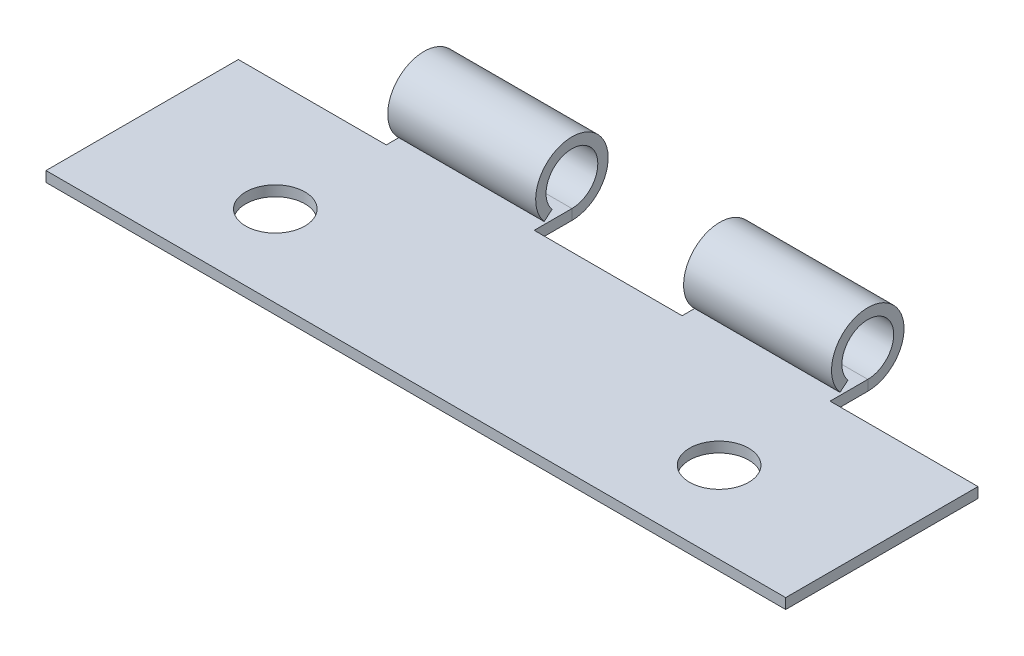
ISO-10303-21;
HEADER;
FILE_DESCRIPTION(('STEP AP214'),'2;1');
FILE_NAME('part.step','',(''),(''),'','','');
FILE_SCHEMA(('AUTOMOTIVE_DESIGN { 1 0 10303 214 1 1 1 1 }'));
ENDSEC;
DATA;
#1=APPLICATION_CONTEXT('core data for automotive mechanical design processes');
#2=APPLICATION_PROTOCOL_DEFINITION('international standard','automotive_design',2000,#1);
#3=PRODUCT_CONTEXT('',#1,'mechanical');
#4=PRODUCT('Part','Part','',(#3));
#5=PRODUCT_RELATED_PRODUCT_CATEGORY('part','',(#4));
#6=PRODUCT_DEFINITION_FORMATION('','',#4);
#7=PRODUCT_DEFINITION_CONTEXT('part definition',#1,'design');
#8=PRODUCT_DEFINITION('design','',#6,#7);
#9=PRODUCT_DEFINITION_SHAPE('','',#8);
#10=(LENGTH_UNIT() NAMED_UNIT(*) SI_UNIT(.MILLI.,.METRE.));
#11=(NAMED_UNIT(*) PLANE_ANGLE_UNIT() SI_UNIT($,.RADIAN.));
#12=(NAMED_UNIT(*) SI_UNIT($,.STERADIAN.) SOLID_ANGLE_UNIT());
#13=UNCERTAINTY_MEASURE_WITH_UNIT(LENGTH_MEASURE(1.E-05),#10,'distance_accuracy_value','');
#14=(GEOMETRIC_REPRESENTATION_CONTEXT(3) GLOBAL_UNCERTAINTY_ASSIGNED_CONTEXT((#13)) GLOBAL_UNIT_ASSIGNED_CONTEXT((#10,
#11,#12)) REPRESENTATION_CONTEXT('',''));
#15=CARTESIAN_POINT('',(0.,0.,0.));
#16=DIRECTION('',(0.,0.,1.));
#17=DIRECTION('',(1.,0.,0.));
#18=AXIS2_PLACEMENT_3D('',#15,#16,#17);
#19=CARTESIAN_POINT('',(5.,-0.7,-18.));
#20=DIRECTION('',(-1.,0.,0.));
#21=DIRECTION('',(0.,0.,1.));
#22=AXIS2_PLACEMENT_3D('',#19,#20,#21);
#23=PLANE('',#22);
#24=DIRECTION('',(0.,0.,1.));
#25=VECTOR('',#24,1.);
#26=CARTESIAN_POINT('',(5.,0.,-18.));
#27=LINE('',#26,#25);
#28=CARTESIAN_POINT('',(5.,0.,-15.55));
#29=VERTEX_POINT('',#28);
#30=CARTESIAN_POINT('',(5.,0.,-13.));
#31=VERTEX_POINT('',#30);
#32=EDGE_CURVE('E283',#29,#31,#27,.T.);
#33=ORIENTED_EDGE('',*,*,#32,.F.);
#34=DIRECTION('',(0.,-1.,0.));
#35=VECTOR('',#34,1.);
#36=CARTESIAN_POINT('',(5.,0.,-15.55));
#37=LINE('',#36,#35);
#38=CARTESIAN_POINT('',(5.,-0.7,-15.55));
#39=VERTEX_POINT('',#38);
#40=EDGE_CURVE('E53',#29,#39,#37,.T.);
#41=ORIENTED_EDGE('',*,*,#40,.T.);
#42=DIRECTION('',(0.,0.,1.));
#43=VECTOR('',#42,1.);
#44=CARTESIAN_POINT('',(5.,-0.7,-18.));
#45=LINE('',#44,#43);
#46=CARTESIAN_POINT('',(5.,-0.7,-13.));
#47=VERTEX_POINT('',#46);
#48=EDGE_CURVE('E160',#39,#47,#45,.T.);
#49=ORIENTED_EDGE('',*,*,#48,.T.);
#50=DIRECTION('',(0.,1.,0.));
#51=VECTOR('',#50,1.);
#52=CARTESIAN_POINT('',(5.,-0.7,-13.));
#53=LINE('',#52,#51);
#54=EDGE_CURVE('E298',#47,#31,#53,.T.);
#55=ORIENTED_EDGE('',*,*,#54,.T.);
#56=EDGE_LOOP('',(#33,#41,#49,#55));
#57=FACE_BOUND('',#56,.T.);
#58=ADVANCED_FACE('F36',(#57),#23,.T.);
#59=CARTESIAN_POINT('',(-15.,-0.7,-18.));
#60=DIRECTION('',(-1.,0.,0.));
#61=DIRECTION('',(0.,0.,1.));
#62=AXIS2_PLACEMENT_3D('',#59,#60,#61);
#63=PLANE('',#62);
#64=DIRECTION('',(0.,0.,1.));
#65=VECTOR('',#64,1.);
#66=CARTESIAN_POINT('',(-15.,0.,-18.));
#67=LINE('',#66,#65);
#68=CARTESIAN_POINT('',(-15.,0.,-15.55));
#69=VERTEX_POINT('',#68);
#70=CARTESIAN_POINT('',(-15.,0.,-13.));
#71=VERTEX_POINT('',#70);
#72=EDGE_CURVE('E290',#69,#71,#67,.T.);
#73=ORIENTED_EDGE('',*,*,#72,.F.);
#74=DIRECTION('',(0.,-1.,0.));
#75=VECTOR('',#74,1.);
#76=CARTESIAN_POINT('',(-15.,0.,-15.55));
#77=LINE('',#76,#75);
#78=CARTESIAN_POINT('',(-15.,-0.7,-15.55));
#79=VERTEX_POINT('',#78);
#80=EDGE_CURVE('E210',#69,#79,#77,.T.);
#81=ORIENTED_EDGE('',*,*,#80,.T.);
#82=DIRECTION('',(0.,0.,1.));
#83=VECTOR('',#82,1.);
#84=CARTESIAN_POINT('',(-15.,-0.7,-18.));
#85=LINE('',#84,#83);
#86=CARTESIAN_POINT('',(-15.,-0.7,-13.));
#87=VERTEX_POINT('',#86);
#88=EDGE_CURVE('E265',#79,#87,#85,.T.);
#89=ORIENTED_EDGE('',*,*,#88,.T.);
#90=DIRECTION('',(0.,1.,0.));
#91=VECTOR('',#90,1.);
#92=CARTESIAN_POINT('',(-15.,-0.7,-13.));
#93=LINE('',#92,#91);
#94=EDGE_CURVE('E45',#87,#71,#93,.T.);
#95=ORIENTED_EDGE('',*,*,#94,.T.);
#96=EDGE_LOOP('',(#73,#81,#89,#95));
#97=FACE_BOUND('',#96,.T.);
#98=ADVANCED_FACE('F337',(#97),#63,.T.);
#99=CARTESIAN_POINT('',(-25.,-0.7,-13.));
#100=DIRECTION('',(-1.,0.,0.));
#101=DIRECTION('',(0.,0.,1.));
#102=AXIS2_PLACEMENT_3D('',#99,#100,#101);
#103=PLANE('',#102);
#104=DIRECTION('',(0.,0.,1.));
#105=VECTOR('',#104,1.);
#106=CARTESIAN_POINT('',(-25.,0.,-13.));
#107=LINE('',#106,#105);
#108=CARTESIAN_POINT('',(-25.,0.,-13.));
#109=VERTEX_POINT('',#108);
#110=CARTESIAN_POINT('',(-25.,0.,0.));
#111=VERTEX_POINT('',#110);
#112=EDGE_CURVE('E245',#109,#111,#107,.T.);
#113=ORIENTED_EDGE('',*,*,#112,.F.);
#114=DIRECTION('',(0.,1.,0.));
#115=VECTOR('',#114,1.);
#116=CARTESIAN_POINT('',(-25.,-0.7,-13.));
#117=LINE('',#116,#115);
#118=CARTESIAN_POINT('',(-25.,-0.7,-13.));
#119=VERTEX_POINT('',#118);
#120=EDGE_CURVE('E11',#119,#109,#117,.T.);
#121=ORIENTED_EDGE('',*,*,#120,.F.);
#122=DIRECTION('',(0.,0.,1.));
#123=VECTOR('',#122,1.);
#124=CARTESIAN_POINT('',(-25.,-0.7,-13.));
#125=LINE('',#124,#123);
#126=CARTESIAN_POINT('',(-25.,-0.7,0.));
#127=VERTEX_POINT('',#126);
#128=EDGE_CURVE('E248',#119,#127,#125,.T.);
#129=ORIENTED_EDGE('',*,*,#128,.T.);
#130=DIRECTION('',(0.,1.,0.));
#131=VECTOR('',#130,1.);
#132=CARTESIAN_POINT('',(-25.,-0.7,0.));
#133=LINE('',#132,#131);
#134=EDGE_CURVE('E40',#127,#111,#133,.T.);
#135=ORIENTED_EDGE('',*,*,#134,.T.);
#136=EDGE_LOOP('',(#113,#121,#129,#135));
#137=FACE_BOUND('',#136,.T.);
#138=ADVANCED_FACE('F38',(#137),#103,.T.);
#139=CARTESIAN_POINT('',(-15.,-0.7,-13.));
#140=DIRECTION('',(0.,0.,-1.));
#141=DIRECTION('',(-1.,0.,0.));
#142=AXIS2_PLACEMENT_3D('',#139,#140,#141);
#143=PLANE('',#142);
#144=DIRECTION('',(-1.,0.,0.));
#145=VECTOR('',#144,1.);
#146=CARTESIAN_POINT('',(-15.,0.,-13.));
#147=LINE('',#146,#145);
#148=EDGE_CURVE('E252',#71,#109,#147,.T.);
#149=ORIENTED_EDGE('',*,*,#148,.F.);
#150=ORIENTED_EDGE('',*,*,#94,.F.);
#151=DIRECTION('',(-1.,0.,0.));
#152=VECTOR('',#151,1.);
#153=CARTESIAN_POINT('',(-15.,-0.7,-13.));
#154=LINE('',#153,#152);
#155=EDGE_CURVE('E267',#87,#119,#154,.T.);
#156=ORIENTED_EDGE('',*,*,#155,.T.);
#157=ORIENTED_EDGE('',*,*,#120,.T.);
#158=EDGE_LOOP('',(#149,#150,#156,#157));
#159=FACE_BOUND('',#158,.T.);
#160=ADVANCED_FACE('F318',(#159),#143,.T.);
#161=CARTESIAN_POINT('',(-5.,-0.7,-13.));
#162=DIRECTION('',(1.,0.,0.));
#163=DIRECTION('',(0.,0.,-1.));
#164=AXIS2_PLACEMENT_3D('',#161,#162,#163);
#165=PLANE('',#164);
#166=DIRECTION('',(0.,-1.,0.));
#167=VECTOR('',#166,1.);
#168=CARTESIAN_POINT('',(-5.,0.,-15.55));
#169=LINE('',#168,#167);
#170=CARTESIAN_POINT('',(-5.,0.,-15.55));
#171=VERTEX_POINT('',#170);
#172=CARTESIAN_POINT('',(-5.,-0.699999999999999,-15.55));
#173=VERTEX_POINT('',#172);
#174=EDGE_CURVE('E227',#171,#173,#169,.T.);
#175=ORIENTED_EDGE('',*,*,#174,.F.);
#176=DIRECTION('',(0.,0.,-1.));
#177=VECTOR('',#176,1.);
#178=CARTESIAN_POINT('',(-5.,0.,-13.));
#179=LINE('',#178,#177);
#180=CARTESIAN_POINT('',(-5.,0.,-13.));
#181=VERTEX_POINT('',#180);
#182=EDGE_CURVE('E288',#181,#171,#179,.T.);
#183=ORIENTED_EDGE('',*,*,#182,.F.);
#184=DIRECTION('',(0.,1.,0.));
#185=VECTOR('',#184,1.);
#186=CARTESIAN_POINT('',(-5.,-0.7,-13.));
#187=LINE('',#186,#185);
#188=CARTESIAN_POINT('',(-5.,-0.7,-13.));
#189=VERTEX_POINT('',#188);
#190=EDGE_CURVE('E296',#189,#181,#187,.T.);
#191=ORIENTED_EDGE('',*,*,#190,.F.);
#192=DIRECTION('',(0.,0.,-1.));
#193=VECTOR('',#192,1.);
#194=CARTESIAN_POINT('',(-5.,-0.7,-13.));
#195=LINE('',#194,#193);
#196=EDGE_CURVE('E263',#189,#173,#195,.T.);
#197=ORIENTED_EDGE('',*,*,#196,.T.);
#198=EDGE_LOOP('',(#175,#183,#191,#197));
#199=FACE_BOUND('',#198,.T.);
#200=ADVANCED_FACE('F347',(#199),#165,.T.);
#201=CARTESIAN_POINT('',(5.,-0.7,-13.));
#202=DIRECTION('',(0.,0.,-1.));
#203=DIRECTION('',(-1.,0.,0.));
#204=AXIS2_PLACEMENT_3D('',#201,#202,#203);
#205=PLANE('',#204);
#206=DIRECTION('',(-1.,0.,0.));
#207=VECTOR('',#206,1.);
#208=CARTESIAN_POINT('',(5.,0.,-13.));
#209=LINE('',#208,#207);
#210=EDGE_CURVE('E285',#31,#181,#209,.T.);
#211=ORIENTED_EDGE('',*,*,#210,.F.);
#212=ORIENTED_EDGE('',*,*,#54,.F.);
#213=DIRECTION('',(-1.,0.,0.));
#214=VECTOR('',#213,1.);
#215=CARTESIAN_POINT('',(5.,-0.7,-13.));
#216=LINE('',#215,#214);
#217=EDGE_CURVE('E260',#47,#189,#216,.T.);
#218=ORIENTED_EDGE('',*,*,#217,.T.);
#219=ORIENTED_EDGE('',*,*,#190,.T.);
#220=EDGE_LOOP('',(#211,#212,#218,#219));
#221=FACE_BOUND('',#220,.T.);
#222=ADVANCED_FACE('F334',(#221),#205,.T.);
#223=CARTESIAN_POINT('',(15.,-0.7,-13.));
#224=DIRECTION('',(1.,0.,0.));
#225=DIRECTION('',(0.,0.,-1.));
#226=AXIS2_PLACEMENT_3D('',#223,#224,#225);
#227=PLANE('',#226);
#228=DIRECTION('',(0.,-1.,0.));
#229=VECTOR('',#228,1.);
#230=CARTESIAN_POINT('',(15.,0.,-15.55));
#231=LINE('',#230,#229);
#232=CARTESIAN_POINT('',(15.,0.,-15.55));
#233=VERTEX_POINT('',#232);
#234=CARTESIAN_POINT('',(15.,-0.699999999999999,-15.55));
#235=VERTEX_POINT('',#234);
#236=EDGE_CURVE('E155',#233,#235,#231,.T.);
#237=ORIENTED_EDGE('',*,*,#236,.F.);
#238=DIRECTION('',(0.,0.,-1.));
#239=VECTOR('',#238,1.);
#240=CARTESIAN_POINT('',(15.,0.,-13.));
#241=LINE('',#240,#239);
#242=CARTESIAN_POINT('',(15.,0.,-13.));
#243=VERTEX_POINT('',#242);
#244=EDGE_CURVE('E281',#243,#233,#241,.T.);
#245=ORIENTED_EDGE('',*,*,#244,.F.);
#246=DIRECTION('',(0.,1.,0.));
#247=VECTOR('',#246,1.);
#248=CARTESIAN_POINT('',(15.,-0.7,-13.));
#249=LINE('',#248,#247);
#250=CARTESIAN_POINT('',(15.,-0.7,-13.));
#251=VERTEX_POINT('',#250);
#252=EDGE_CURVE('E156',#251,#243,#249,.T.);
#253=ORIENTED_EDGE('',*,*,#252,.F.);
#254=DIRECTION('',(0.,0.,-1.));
#255=VECTOR('',#254,1.);
#256=CARTESIAN_POINT('',(15.,-0.7,-13.));
#257=LINE('',#256,#255);
#258=EDGE_CURVE('E150',#251,#235,#257,.T.);
#259=ORIENTED_EDGE('',*,*,#258,.T.);
#260=EDGE_LOOP('',(#237,#245,#253,#259));
#261=FACE_BOUND('',#260,.T.);
#262=ADVANCED_FACE('F152',(#261),#227,.T.);
#263=CARTESIAN_POINT('',(25.,-0.7,-13.));
#264=DIRECTION('',(0.,0.,-1.));
#265=DIRECTION('',(-1.,0.,0.));
#266=AXIS2_PLACEMENT_3D('',#263,#264,#265);
#267=PLANE('',#266);
#268=DIRECTION('',(-1.,0.,0.));
#269=VECTOR('',#268,1.);
#270=CARTESIAN_POINT('',(25.,0.,-13.));
#271=LINE('',#270,#269);
#272=CARTESIAN_POINT('',(25.,0.,-13.));
#273=VERTEX_POINT('',#272);
#274=EDGE_CURVE('E278',#273,#243,#271,.T.);
#275=ORIENTED_EDGE('',*,*,#274,.F.);
#276=DIRECTION('',(0.,1.,0.));
#277=VECTOR('',#276,1.);
#278=CARTESIAN_POINT('',(25.,-0.7,-13.));
#279=LINE('',#278,#277);
#280=CARTESIAN_POINT('',(25.,-0.7,-13.));
#281=VERTEX_POINT('',#280);
#282=EDGE_CURVE('E302',#281,#273,#279,.T.);
#283=ORIENTED_EDGE('',*,*,#282,.F.);
#284=DIRECTION('',(-1.,0.,0.));
#285=VECTOR('',#284,1.);
#286=CARTESIAN_POINT('',(25.,-0.7,-13.));
#287=LINE('',#286,#285);
#288=EDGE_CURVE('E161',#281,#251,#287,.T.);
#289=ORIENTED_EDGE('',*,*,#288,.T.);
#290=ORIENTED_EDGE('',*,*,#252,.T.);
#291=EDGE_LOOP('',(#275,#283,#289,#290));
#292=FACE_BOUND('',#291,.T.);
#293=ADVANCED_FACE('F326',(#292),#267,.T.);
#294=CARTESIAN_POINT('',(25.,-0.7,0.));
#295=DIRECTION('',(1.,0.,0.));
#296=DIRECTION('',(0.,0.,-1.));
#297=AXIS2_PLACEMENT_3D('',#294,#295,#296);
#298=PLANE('',#297);
#299=DIRECTION('',(0.,0.,-1.));
#300=VECTOR('',#299,1.);
#301=CARTESIAN_POINT('',(25.,0.,0.));
#302=LINE('',#301,#300);
#303=CARTESIAN_POINT('',(25.,0.,0.));
#304=VERTEX_POINT('',#303);
#305=EDGE_CURVE('E275',#304,#273,#302,.T.);
#306=ORIENTED_EDGE('',*,*,#305,.F.);
#307=DIRECTION('',(0.,1.,0.));
#308=VECTOR('',#307,1.);
#309=CARTESIAN_POINT('',(25.,-0.7,0.));
#310=LINE('',#309,#308);
#311=CARTESIAN_POINT('',(25.,-0.7,0.));
#312=VERTEX_POINT('',#311);
#313=EDGE_CURVE('E303',#312,#304,#310,.T.);
#314=ORIENTED_EDGE('',*,*,#313,.F.);
#315=DIRECTION('',(0.,0.,-1.));
#316=VECTOR('',#315,1.);
#317=CARTESIAN_POINT('',(25.,-0.7,0.));
#318=LINE('',#317,#316);
#319=EDGE_CURVE('E255',#312,#281,#318,.T.);
#320=ORIENTED_EDGE('',*,*,#319,.T.);
#321=ORIENTED_EDGE('',*,*,#282,.T.);
#322=EDGE_LOOP('',(#306,#314,#320,#321));
#323=FACE_BOUND('',#322,.T.);
#324=ADVANCED_FACE('F323',(#323),#298,.T.);
#325=CARTESIAN_POINT('',(-25.,-0.7,0.));
#326=DIRECTION('',(0.,0.,1.));
#327=DIRECTION('',(1.,0.,0.));
#328=AXIS2_PLACEMENT_3D('',#325,#326,#327);
#329=PLANE('',#328);
#330=DIRECTION('',(1.,0.,0.));
#331=VECTOR('',#330,1.);
#332=CARTESIAN_POINT('',(-25.,0.,0.));
#333=LINE('',#332,#331);
#334=EDGE_CURVE('E272',#111,#304,#333,.T.);
#335=ORIENTED_EDGE('',*,*,#334,.F.);
#336=ORIENTED_EDGE('',*,*,#134,.F.);
#337=DIRECTION('',(1.,0.,0.));
#338=VECTOR('',#337,1.);
#339=CARTESIAN_POINT('',(-25.,-0.7,0.));
#340=LINE('',#339,#338);
#341=EDGE_CURVE('E251',#127,#312,#340,.T.);
#342=ORIENTED_EDGE('',*,*,#341,.T.);
#343=ORIENTED_EDGE('',*,*,#313,.T.);
#344=EDGE_LOOP('',(#335,#336,#342,#343));
#345=FACE_BOUND('',#344,.T.);
#346=ADVANCED_FACE('F311',(#345),#329,.T.);
#347=CARTESIAN_POINT('',(0.,-0.7,0.));
#348=DIRECTION('',(0.,1.,0.));
#349=DIRECTION('',(0.,0.,1.));
#350=AXIS2_PLACEMENT_3D('',#347,#348,#349);
#351=PLANE('',#350);
#352=CARTESIAN_POINT('',(15.,-0.7,-5.5));
#353=DIRECTION('',(0.,1.,0.));
#354=DIRECTION('',(0.,0.,-1.));
#355=AXIS2_PLACEMENT_3D('',#352,#353,#354);
#356=CIRCLE('',#355,2.);
#357=CARTESIAN_POINT('',(15.,-0.7,-7.5));
#358=VERTEX_POINT('',#357);
#359=EDGE_CURVE('E236',#358,#358,#356,.T.);
#360=ORIENTED_EDGE('',*,*,#359,.T.);
#361=EDGE_LOOP('',(#360));
#362=FACE_BOUND('',#361,.T.);
#363=CARTESIAN_POINT('',(-15.,-0.7,-5.5));
#364=DIRECTION('',(0.,1.,0.));
#365=DIRECTION('',(0.,0.,1.));
#366=AXIS2_PLACEMENT_3D('',#363,#364,#365);
#367=CIRCLE('',#366,2.);
#368=CARTESIAN_POINT('',(-15.,-0.7,-3.5));
#369=VERTEX_POINT('',#368);
#370=EDGE_CURVE('E242',#369,#369,#367,.T.);
#371=ORIENTED_EDGE('',*,*,#370,.T.);
#372=EDGE_LOOP('',(#371));
#373=FACE_BOUND('',#372,.T.);
#374=ORIENTED_EDGE('',*,*,#48,.F.);
#375=DIRECTION('',(-1.,0.,0.));
#376=VECTOR('',#375,1.);
#377=CARTESIAN_POINT('',(5.,-0.699999999999999,-15.55));
#378=LINE('',#377,#376);
#379=EDGE_CURVE('E164',#39,#235,#378,.F.);
#380=ORIENTED_EDGE('',*,*,#379,.T.);
#381=ORIENTED_EDGE('',*,*,#258,.F.);
#382=ORIENTED_EDGE('',*,*,#288,.F.);
#383=ORIENTED_EDGE('',*,*,#319,.F.);
#384=ORIENTED_EDGE('',*,*,#341,.F.);
#385=ORIENTED_EDGE('',*,*,#128,.F.);
#386=ORIENTED_EDGE('',*,*,#155,.F.);
#387=ORIENTED_EDGE('',*,*,#88,.F.);
#388=DIRECTION('',(-1.,0.,0.));
#389=VECTOR('',#388,1.);
#390=CARTESIAN_POINT('',(-15.,-0.699999999999999,-15.55));
#391=LINE('',#390,#389);
#392=EDGE_CURVE('E203',#79,#173,#391,.F.);
#393=ORIENTED_EDGE('',*,*,#392,.T.);
#394=ORIENTED_EDGE('',*,*,#196,.F.);
#395=ORIENTED_EDGE('',*,*,#217,.F.);
#396=EDGE_LOOP('',(#374,#380,#381,#382,#383,#384,#385,#386,#387,#393,#394,#395));
#397=FACE_BOUND('',#396,.T.);
#398=ADVANCED_FACE('F165',(#362,#373,#397),#351,.F.);
#399=CARTESIAN_POINT('',(0.,0.,0.));
#400=DIRECTION('',(0.,1.,0.));
#401=DIRECTION('',(0.,0.,1.));
#402=AXIS2_PLACEMENT_3D('',#399,#400,#401);
#403=PLANE('',#402);
#404=DIRECTION('',(-1.,0.,0.));
#405=VECTOR('',#404,1.);
#406=CARTESIAN_POINT('',(5.,0.,-15.55));
#407=LINE('',#406,#405);
#408=EDGE_CURVE('E61',#29,#233,#407,.F.);
#409=ORIENTED_EDGE('',*,*,#408,.F.);
#410=ORIENTED_EDGE('',*,*,#32,.T.);
#411=ORIENTED_EDGE('',*,*,#210,.T.);
#412=ORIENTED_EDGE('',*,*,#182,.T.);
#413=DIRECTION('',(-1.,0.,0.));
#414=VECTOR('',#413,1.);
#415=CARTESIAN_POINT('',(-15.,0.,-15.55));
#416=LINE('',#415,#414);
#417=EDGE_CURVE('E219',#69,#171,#416,.F.);
#418=ORIENTED_EDGE('',*,*,#417,.F.);
#419=ORIENTED_EDGE('',*,*,#72,.T.);
#420=ORIENTED_EDGE('',*,*,#148,.T.);
#421=ORIENTED_EDGE('',*,*,#112,.T.);
#422=ORIENTED_EDGE('',*,*,#334,.T.);
#423=ORIENTED_EDGE('',*,*,#305,.T.);
#424=ORIENTED_EDGE('',*,*,#274,.T.);
#425=ORIENTED_EDGE('',*,*,#244,.T.);
#426=EDGE_LOOP('',(#409,#410,#411,#412,#418,#419,#420,#421,#422,#423,#424,#425));
#427=FACE_BOUND('',#426,.T.);
#428=CARTESIAN_POINT('',(15.,0.,-5.5));
#429=DIRECTION('',(0.,1.,0.));
#430=DIRECTION('',(0.,0.,-1.));
#431=AXIS2_PLACEMENT_3D('',#428,#429,#430);
#432=CIRCLE('',#431,2.);
#433=CARTESIAN_POINT('',(15.,0.,-7.5));
#434=VERTEX_POINT('',#433);
#435=EDGE_CURVE('E234',#434,#434,#432,.T.);
#436=ORIENTED_EDGE('',*,*,#435,.F.);
#437=EDGE_LOOP('',(#436));
#438=FACE_BOUND('',#437,.T.);
#439=CARTESIAN_POINT('',(-15.,0.,-5.5));
#440=DIRECTION('',(0.,1.,0.));
#441=DIRECTION('',(0.,0.,1.));
#442=AXIS2_PLACEMENT_3D('',#439,#440,#441);
#443=CIRCLE('',#442,2.);
#444=CARTESIAN_POINT('',(-15.,0.,-3.5));
#445=VERTEX_POINT('',#444);
#446=EDGE_CURVE('E239',#445,#445,#443,.T.);
#447=ORIENTED_EDGE('',*,*,#446,.F.);
#448=EDGE_LOOP('',(#447));
#449=FACE_BOUND('',#448,.T.);
#450=ADVANCED_FACE('F312',(#427,#438,#449),#403,.T.);
#451=CARTESIAN_POINT('',(-15.,-0.7,-5.5));
#452=DIRECTION('',(0.,1.,0.));
#453=DIRECTION('',(0.,0.,1.));
#454=AXIS2_PLACEMENT_3D('',#451,#452,#453);
#455=CYLINDRICAL_SURFACE('',#454,2.);
#456=ORIENTED_EDGE('',*,*,#370,.F.);
#457=EDGE_LOOP('',(#456));
#458=FACE_BOUND('',#457,.T.);
#459=ORIENTED_EDGE('',*,*,#446,.T.);
#460=EDGE_LOOP('',(#459));
#461=FACE_BOUND('',#460,.T.);
#462=ADVANCED_FACE('F356',(#458,#461),#455,.F.);
#463=CARTESIAN_POINT('',(15.,-0.7,-5.5));
#464=DIRECTION('',(0.,1.,0.));
#465=DIRECTION('',(0.,0.,1.));
#466=AXIS2_PLACEMENT_3D('',#463,#464,#465);
#467=CYLINDRICAL_SURFACE('',#466,2.);
#468=ORIENTED_EDGE('',*,*,#359,.F.);
#469=EDGE_LOOP('',(#468));
#470=FACE_BOUND('',#469,.T.);
#471=ORIENTED_EDGE('',*,*,#435,.T.);
#472=EDGE_LOOP('',(#471));
#473=FACE_BOUND('',#472,.T.);
#474=ADVANCED_FACE('F362',(#470,#473),#467,.F.);
#475=CARTESIAN_POINT('',(-10.,0.625121683048546,-14.2094222245418));
#476=DIRECTION('',(0.,0.766044443118973,0.642787609686546));
#477=DIRECTION('',(-1.,0.,0.));
#478=AXIS2_PLACEMENT_3D('',#475,#476,#477);
#479=PLANE('',#478);
#480=DIRECTION('',(0.,-0.642787609686545,0.766044443118973));
#481=VECTOR('',#480,1.);
#482=CARTESIAN_POINT('',(-15.,0.625121683048546,-14.2094222245418));
#483=LINE('',#482,#481);
#484=CARTESIAN_POINT('',(-15.,0.625121683048546,-14.2094222245418));
#485=VERTEX_POINT('',#484);
#486=CARTESIAN_POINT('',(-15.,0.175170356267964,-13.6731911143585));
#487=VERTEX_POINT('',#486);
#488=EDGE_CURVE('E232',#485,#487,#483,.T.);
#489=ORIENTED_EDGE('',*,*,#488,.F.);
#490=DIRECTION('',(-1.,0.,0.));
#491=VECTOR('',#490,1.);
#492=CARTESIAN_POINT('',(-15.,0.625121683048546,-14.2094222245418));
#493=LINE('',#492,#491);
#494=CARTESIAN_POINT('',(-5.,0.625121683048545,-14.2094222245418));
#495=VERTEX_POINT('',#494);
#496=EDGE_CURVE('E201',#495,#485,#493,.T.);
#497=ORIENTED_EDGE('',*,*,#496,.F.);
#498=DIRECTION('',(0.,-0.642787609686545,0.766044443118973));
#499=VECTOR('',#498,1.);
#500=CARTESIAN_POINT('',(-5.,0.625121683048545,-14.2094222245418));
#501=LINE('',#500,#499);
#502=CARTESIAN_POINT('',(-5.,0.175170356267964,-13.6731911143585));
#503=VERTEX_POINT('',#502);
#504=EDGE_CURVE('E230',#495,#503,#501,.T.);
#505=ORIENTED_EDGE('',*,*,#504,.T.);
#506=DIRECTION('',(-1.,0.,0.));
#507=VECTOR('',#506,1.);
#508=CARTESIAN_POINT('',(-15.,0.175170356267964,-13.6731911143585));
#509=LINE('',#508,#507);
#510=EDGE_CURVE('E211',#503,#487,#509,.T.);
#511=ORIENTED_EDGE('',*,*,#510,.T.);
#512=EDGE_LOOP('',(#489,#497,#505,#511));
#513=FACE_BOUND('',#512,.T.);
#514=ADVANCED_FACE('F366',(#513),#479,.F.);
#515=CARTESIAN_POINT('',(-5.,1.75,-15.55));
#516=DIRECTION('',(1.,0.,0.));
#517=DIRECTION('',(0.,1.,0.));
#518=AXIS2_PLACEMENT_3D('',#515,#516,#517);
#519=PLANE('',#518);
#520=ORIENTED_EDGE('',*,*,#504,.F.);
#521=CARTESIAN_POINT('',(-5.,1.75,-15.55));
#522=DIRECTION('',(-1.,0.,0.));
#523=DIRECTION('',(0.,-1.,0.));
#524=AXIS2_PLACEMENT_3D('',#521,#522,#523);
#525=CIRCLE('',#524,1.75);
#526=EDGE_CURVE('E214',#171,#495,#525,.F.);
#527=ORIENTED_EDGE('',*,*,#526,.F.);
#528=ORIENTED_EDGE('',*,*,#174,.T.);
#529=CARTESIAN_POINT('',(-5.,1.75,-15.55));
#530=DIRECTION('',(-1.,0.,0.));
#531=DIRECTION('',(0.,-1.,0.));
#532=AXIS2_PLACEMENT_3D('',#529,#530,#531);
#533=CIRCLE('',#532,2.45);
#534=EDGE_CURVE('E206',#173,#503,#533,.F.);
#535=ORIENTED_EDGE('',*,*,#534,.T.);
#536=EDGE_LOOP('',(#520,#527,#528,#535));
#537=FACE_BOUND('',#536,.T.);
#538=ADVANCED_FACE('F372',(#537),#519,.T.);
#539=CARTESIAN_POINT('',(-15.,1.75,-15.55));
#540=DIRECTION('',(1.,0.,0.));
#541=DIRECTION('',(0.,1.,0.));
#542=AXIS2_PLACEMENT_3D('',#539,#540,#541);
#543=PLANE('',#542);
#544=CARTESIAN_POINT('',(-15.,1.75,-15.55));
#545=DIRECTION('',(-1.,0.,0.));
#546=DIRECTION('',(0.,-1.,0.));
#547=AXIS2_PLACEMENT_3D('',#544,#545,#546);
#548=CIRCLE('',#547,1.75);
#549=EDGE_CURVE('E222',#485,#69,#548,.T.);
#550=ORIENTED_EDGE('',*,*,#549,.F.);
#551=ORIENTED_EDGE('',*,*,#488,.T.);
#552=CARTESIAN_POINT('',(-15.,1.75,-15.55));
#553=DIRECTION('',(-1.,0.,0.));
#554=DIRECTION('',(0.,-1.,0.));
#555=AXIS2_PLACEMENT_3D('',#552,#553,#554);
#556=CIRCLE('',#555,2.45);
#557=EDGE_CURVE('E207',#487,#79,#556,.T.);
#558=ORIENTED_EDGE('',*,*,#557,.T.);
#559=ORIENTED_EDGE('',*,*,#80,.F.);
#560=EDGE_LOOP('',(#550,#551,#558,#559));
#561=FACE_BOUND('',#560,.T.);
#562=ADVANCED_FACE('F368',(#561),#543,.F.);
#563=CARTESIAN_POINT('',(-15.,1.75,-15.55));
#564=DIRECTION('',(-1.,0.,0.));
#565=DIRECTION('',(0.,-0.642787609686546,0.766044443118973));
#566=AXIS2_PLACEMENT_3D('',#563,#564,#565);
#567=CYLINDRICAL_SURFACE('',#566,2.45);
#568=ORIENTED_EDGE('',*,*,#392,.F.);
#569=ORIENTED_EDGE('',*,*,#557,.F.);
#570=ORIENTED_EDGE('',*,*,#510,.F.);
#571=ORIENTED_EDGE('',*,*,#534,.F.);
#572=EDGE_LOOP('',(#568,#569,#570,#571));
#573=FACE_BOUND('',#572,.T.);
#574=ADVANCED_FACE('F371',(#573),#567,.T.);
#575=CARTESIAN_POINT('',(-15.,1.75,-15.55));
#576=DIRECTION('',(-1.,0.,0.));
#577=DIRECTION('',(0.,-0.642787609686546,0.766044443118973));
#578=AXIS2_PLACEMENT_3D('',#575,#576,#577);
#579=CYLINDRICAL_SURFACE('',#578,1.75);
#580=ORIENTED_EDGE('',*,*,#417,.T.);
#581=ORIENTED_EDGE('',*,*,#526,.T.);
#582=ORIENTED_EDGE('',*,*,#496,.T.);
#583=ORIENTED_EDGE('',*,*,#549,.T.);
#584=EDGE_LOOP('',(#580,#581,#582,#583));
#585=FACE_BOUND('',#584,.T.);
#586=ADVANCED_FACE('F380',(#585),#579,.F.);
#587=CARTESIAN_POINT('',(10.,0.625121683048547,-14.2094222245418));
#588=DIRECTION('',(0.,0.766044443118973,0.642787609686545));
#589=DIRECTION('',(-1.,0.,0.));
#590=AXIS2_PLACEMENT_3D('',#587,#588,#589);
#591=PLANE('',#590);
#592=DIRECTION('',(0.,-0.642787609686545,0.766044443118973));
#593=VECTOR('',#592,1.);
#594=CARTESIAN_POINT('',(5.,0.625121683048547,-14.2094222245418));
#595=LINE('',#594,#593);
#596=CARTESIAN_POINT('',(5.,0.625121683048547,-14.2094222245418));
#597=VERTEX_POINT('',#596);
#598=CARTESIAN_POINT('',(5.,0.175170356267966,-13.6731911143585));
#599=VERTEX_POINT('',#598);
#600=EDGE_CURVE('E200',#597,#599,#595,.T.);
#601=ORIENTED_EDGE('',*,*,#600,.F.);
#602=DIRECTION('',(-1.,0.,0.));
#603=VECTOR('',#602,1.);
#604=CARTESIAN_POINT('',(5.,0.625121683048547,-14.2094222245418));
#605=LINE('',#604,#603);
#606=CARTESIAN_POINT('',(15.,0.625121683048547,-14.2094222245418));
#607=VERTEX_POINT('',#606);
#608=EDGE_CURVE('E196',#607,#597,#605,.T.);
#609=ORIENTED_EDGE('',*,*,#608,.F.);
#610=DIRECTION('',(0.,-0.642787609686545,0.766044443118973));
#611=VECTOR('',#610,1.);
#612=CARTESIAN_POINT('',(15.,0.625121683048547,-14.2094222245418));
#613=LINE('',#612,#611);
#614=CARTESIAN_POINT('',(15.,0.175170356267966,-13.6731911143585));
#615=VERTEX_POINT('',#614);
#616=EDGE_CURVE('E180',#607,#615,#613,.T.);
#617=ORIENTED_EDGE('',*,*,#616,.T.);
#618=DIRECTION('',(-1.,0.,0.));
#619=VECTOR('',#618,1.);
#620=CARTESIAN_POINT('',(5.,0.175170356267967,-13.6731911143585));
#621=LINE('',#620,#619);
#622=EDGE_CURVE('E185',#615,#599,#621,.T.);
#623=ORIENTED_EDGE('',*,*,#622,.T.);
#624=EDGE_LOOP('',(#601,#609,#617,#623));
#625=FACE_BOUND('',#624,.T.);
#626=ADVANCED_FACE('F383',(#625),#591,.F.);
#627=CARTESIAN_POINT('',(15.,1.75,-15.55));
#628=DIRECTION('',(1.,0.,0.));
#629=DIRECTION('',(0.,0.,-1.));
#630=AXIS2_PLACEMENT_3D('',#627,#628,#629);
#631=PLANE('',#630);
#632=ORIENTED_EDGE('',*,*,#616,.F.);
#633=CARTESIAN_POINT('',(15.,1.75,-15.55));
#634=DIRECTION('',(-1.,0.,0.));
#635=DIRECTION('',(0.,0.,1.));
#636=AXIS2_PLACEMENT_3D('',#633,#634,#635);
#637=CIRCLE('',#636,1.75);
#638=EDGE_CURVE('E179',#233,#607,#637,.F.);
#639=ORIENTED_EDGE('',*,*,#638,.F.);
#640=ORIENTED_EDGE('',*,*,#236,.T.);
#641=CARTESIAN_POINT('',(15.,1.75,-15.55));
#642=DIRECTION('',(-1.,0.,0.));
#643=DIRECTION('',(0.,0.,1.));
#644=AXIS2_PLACEMENT_3D('',#641,#642,#643);
#645=CIRCLE('',#644,2.45);
#646=EDGE_CURVE('E171',#235,#615,#645,.F.);
#647=ORIENTED_EDGE('',*,*,#646,.T.);
#648=EDGE_LOOP('',(#632,#639,#640,#647));
#649=FACE_BOUND('',#648,.T.);
#650=ADVANCED_FACE('F177',(#649),#631,.T.);
#651=CARTESIAN_POINT('',(5.,1.75,-15.55));
#652=DIRECTION('',(1.,0.,0.));
#653=DIRECTION('',(0.,0.,-1.));
#654=AXIS2_PLACEMENT_3D('',#651,#652,#653);
#655=PLANE('',#654);
#656=CARTESIAN_POINT('',(5.,1.75,-15.55));
#657=DIRECTION('',(-1.,0.,0.));
#658=DIRECTION('',(0.,0.,1.));
#659=AXIS2_PLACEMENT_3D('',#656,#657,#658);
#660=CIRCLE('',#659,1.75);
#661=EDGE_CURVE('E193',#597,#29,#660,.T.);
#662=ORIENTED_EDGE('',*,*,#661,.F.);
#663=ORIENTED_EDGE('',*,*,#600,.T.);
#664=CARTESIAN_POINT('',(5.,1.75,-15.55));
#665=DIRECTION('',(-1.,0.,0.));
#666=DIRECTION('',(0.,0.,1.));
#667=AXIS2_PLACEMENT_3D('',#664,#665,#666);
#668=CIRCLE('',#667,2.45);
#669=EDGE_CURVE('E172',#599,#39,#668,.T.);
#670=ORIENTED_EDGE('',*,*,#669,.T.);
#671=ORIENTED_EDGE('',*,*,#40,.F.);
#672=EDGE_LOOP('',(#662,#663,#670,#671));
#673=FACE_BOUND('',#672,.T.);
#674=ADVANCED_FACE('F388',(#673),#655,.F.);
#675=CARTESIAN_POINT('',(5.,1.75,-15.55));
#676=DIRECTION('',(-1.,0.,0.));
#677=DIRECTION('',(0.,-0.642787609686545,0.766044443118973));
#678=AXIS2_PLACEMENT_3D('',#675,#676,#677);
#679=CYLINDRICAL_SURFACE('',#678,2.45);
#680=ORIENTED_EDGE('',*,*,#379,.F.);
#681=ORIENTED_EDGE('',*,*,#669,.F.);
#682=ORIENTED_EDGE('',*,*,#622,.F.);
#683=ORIENTED_EDGE('',*,*,#646,.F.);
#684=EDGE_LOOP('',(#680,#681,#682,#683));
#685=FACE_BOUND('',#684,.T.);
#686=ADVANCED_FACE('F183',(#685),#679,.T.);
#687=CARTESIAN_POINT('',(5.,1.75,-15.55));
#688=DIRECTION('',(-1.,0.,0.));
#689=DIRECTION('',(0.,-0.642787609686545,0.766044443118973));
#690=AXIS2_PLACEMENT_3D('',#687,#688,#689);
#691=CYLINDRICAL_SURFACE('',#690,1.75);
#692=ORIENTED_EDGE('',*,*,#408,.T.);
#693=ORIENTED_EDGE('',*,*,#638,.T.);
#694=ORIENTED_EDGE('',*,*,#608,.T.);
#695=ORIENTED_EDGE('',*,*,#661,.T.);
#696=EDGE_LOOP('',(#692,#693,#694,#695));
#697=FACE_BOUND('',#696,.T.);
#698=ADVANCED_FACE('F397',(#697),#691,.F.);
#699=CLOSED_SHELL('',(#58,#98,#138,#160,#200,#222,#262,#293,#324,#346,#398,#450,#462,#474,#514,
#538,#562,#574,#586,#626,#650,#674,#686,#698));
#700=MANIFOLD_SOLID_BREP('B2',#699);
#701=ADVANCED_BREP_SHAPE_REPRESENTATION('',(#18,#700),#14);
#702=SHAPE_DEFINITION_REPRESENTATION(#9,#701);
ENDSEC;
END-ISO-10303-21;
